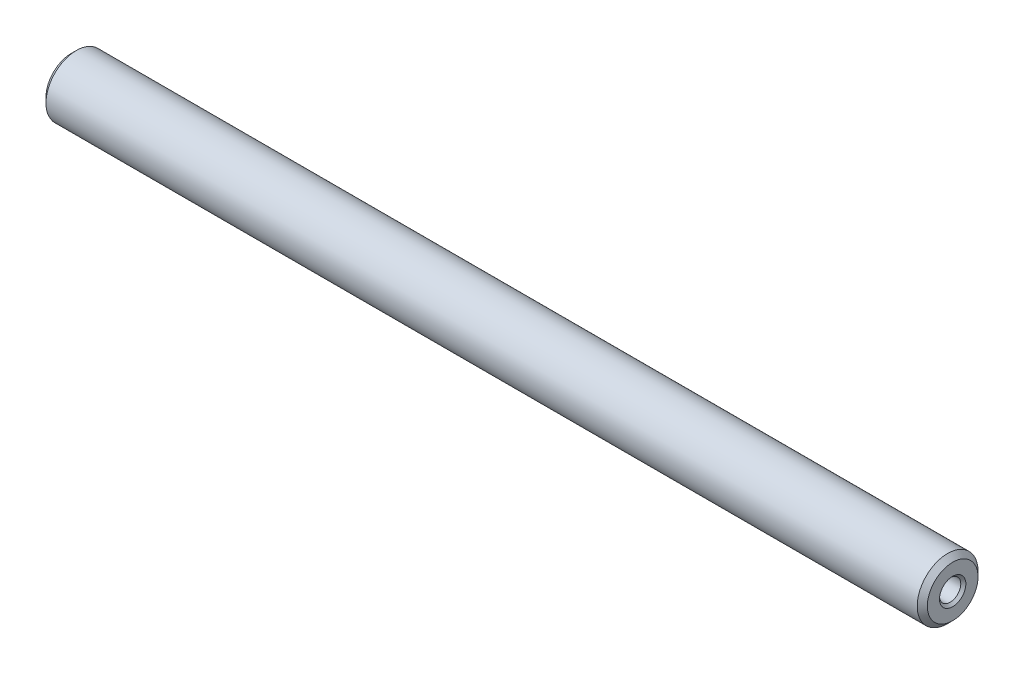
ISO-10303-21;
HEADER;
FILE_DESCRIPTION(('STEP AP214'),'2;1');
FILE_NAME('part.step','',(''),(''),'','','');
FILE_SCHEMA(('AUTOMOTIVE_DESIGN { 1 0 10303 214 1 1 1 1 }'));
ENDSEC;
DATA;
#1=APPLICATION_CONTEXT('core data for automotive mechanical design processes');
#2=APPLICATION_PROTOCOL_DEFINITION('international standard','automotive_design',2000,#1);
#3=PRODUCT_CONTEXT('',#1,'mechanical');
#4=PRODUCT('Part','Part','',(#3));
#5=PRODUCT_RELATED_PRODUCT_CATEGORY('part','',(#4));
#6=PRODUCT_DEFINITION_FORMATION('','',#4);
#7=PRODUCT_DEFINITION_CONTEXT('part definition',#1,'design');
#8=PRODUCT_DEFINITION('design','',#6,#7);
#9=PRODUCT_DEFINITION_SHAPE('','',#8);
#10=(LENGTH_UNIT() NAMED_UNIT(*) SI_UNIT(.MILLI.,.METRE.));
#11=(NAMED_UNIT(*) PLANE_ANGLE_UNIT() SI_UNIT($,.RADIAN.));
#12=(NAMED_UNIT(*) SI_UNIT($,.STERADIAN.) SOLID_ANGLE_UNIT());
#13=UNCERTAINTY_MEASURE_WITH_UNIT(LENGTH_MEASURE(1.E-05),#10,'distance_accuracy_value','');
#14=(GEOMETRIC_REPRESENTATION_CONTEXT(3) GLOBAL_UNCERTAINTY_ASSIGNED_CONTEXT((#13)) GLOBAL_UNIT_ASSIGNED_CONTEXT((#10,
#11,#12)) REPRESENTATION_CONTEXT('',''));
#15=CARTESIAN_POINT('',(0.,0.,0.));
#16=DIRECTION('',(0.,0.,1.));
#17=DIRECTION('',(1.,0.,0.));
#18=AXIS2_PLACEMENT_3D('',#15,#16,#17);
#19=CARTESIAN_POINT('',(174.,0.,0.));
#20=DIRECTION('',(-1.,0.,0.));
#21=DIRECTION('',(0.,0.,1.));
#22=AXIS2_PLACEMENT_3D('',#19,#20,#21);
#23=CYLINDRICAL_SURFACE('',#22,6.);
#24=CARTESIAN_POINT('',(173.,0.,0.));
#25=DIRECTION('',(1.,0.,0.));
#26=DIRECTION('',(0.,0.,-1.));
#27=AXIS2_PLACEMENT_3D('',#24,#25,#26);
#28=CIRCLE('',#27,6.);
#29=CARTESIAN_POINT('',(173.,0.,-6.));
#30=VERTEX_POINT('',#29);
#31=EDGE_CURVE('E72',#30,#30,#28,.F.);
#32=ORIENTED_EDGE('',*,*,#31,.T.);
#33=EDGE_LOOP('',(#32));
#34=FACE_BOUND('',#33,.T.);
#35=CARTESIAN_POINT('',(1.00000000000003,0.,0.));
#36=DIRECTION('',(1.,0.,0.));
#37=DIRECTION('',(0.,0.,-1.));
#38=AXIS2_PLACEMENT_3D('',#35,#36,#37);
#39=CIRCLE('',#38,6.);
#40=CARTESIAN_POINT('',(1.00000000000003,0.,-6.));
#41=VERTEX_POINT('',#40);
#42=EDGE_CURVE('E69',#41,#41,#39,.T.);
#43=ORIENTED_EDGE('',*,*,#42,.T.);
#44=EDGE_LOOP('',(#43));
#45=FACE_BOUND('',#44,.T.);
#46=ADVANCED_FACE('F37',(#34,#45),#23,.T.);
#47=CARTESIAN_POINT('',(174.,0.,0.));
#48=DIRECTION('',(1.,0.,0.));
#49=DIRECTION('',(0.,0.,-1.));
#50=AXIS2_PLACEMENT_3D('',#47,#48,#49);
#51=PLANE('',#50);
#52=CARTESIAN_POINT('',(174.,0.,0.));
#53=DIRECTION('',(1.,0.,0.));
#54=DIRECTION('',(0.,0.,-1.));
#55=AXIS2_PLACEMENT_3D('',#52,#53,#54);
#56=CIRCLE('',#55,2.59999999999995);
#57=CARTESIAN_POINT('',(174.,0.,-2.59999999999995));
#58=VERTEX_POINT('',#57);
#59=EDGE_CURVE('E81',#58,#58,#56,.F.);
#60=ORIENTED_EDGE('',*,*,#59,.T.);
#61=EDGE_LOOP('',(#60));
#62=FACE_BOUND('',#61,.T.);
#63=CARTESIAN_POINT('',(174.,0.,0.));
#64=DIRECTION('',(1.,0.,0.));
#65=DIRECTION('',(0.,0.,-1.));
#66=AXIS2_PLACEMENT_3D('',#63,#64,#65);
#67=CIRCLE('',#66,4.99999999999999);
#68=CARTESIAN_POINT('',(174.,0.,-4.99999999999999));
#69=VERTEX_POINT('',#68);
#70=EDGE_CURVE('E64',#69,#69,#67,.T.);
#71=ORIENTED_EDGE('',*,*,#70,.T.);
#72=EDGE_LOOP('',(#71));
#73=FACE_BOUND('',#72,.T.);
#74=ADVANCED_FACE('F95',(#62,#73),#51,.T.);
#75=CARTESIAN_POINT('',(0.,0.,0.));
#76=DIRECTION('',(1.,0.,0.));
#77=DIRECTION('',(0.,0.,-1.));
#78=AXIS2_PLACEMENT_3D('',#75,#76,#77);
#79=PLANE('',#78);
#80=CARTESIAN_POINT('',(0.,0.,0.));
#81=DIRECTION('',(1.,0.,0.));
#82=DIRECTION('',(0.,0.,-1.));
#83=AXIS2_PLACEMENT_3D('',#80,#81,#82);
#84=CIRCLE('',#83,2.60000000000002);
#85=CARTESIAN_POINT('',(0.,0.,-2.60000000000002));
#86=VERTEX_POINT('',#85);
#87=EDGE_CURVE('E11',#86,#86,#84,.T.);
#88=ORIENTED_EDGE('',*,*,#87,.T.);
#89=EDGE_LOOP('',(#88));
#90=FACE_BOUND('',#89,.T.);
#91=CARTESIAN_POINT('',(0.,0.,0.));
#92=DIRECTION('',(1.,0.,0.));
#93=DIRECTION('',(0.,0.,-1.));
#94=AXIS2_PLACEMENT_3D('',#91,#92,#93);
#95=CIRCLE('',#94,4.99999999999998);
#96=CARTESIAN_POINT('',(0.,0.,-4.99999999999998));
#97=VERTEX_POINT('',#96);
#98=EDGE_CURVE('E75',#97,#97,#95,.F.);
#99=ORIENTED_EDGE('',*,*,#98,.T.);
#100=EDGE_LOOP('',(#99));
#101=FACE_BOUND('',#100,.T.);
#102=ADVANCED_FACE('F101',(#90,#101),#79,.F.);
#103=CARTESIAN_POINT('',(174.,0.,0.));
#104=DIRECTION('',(-1.,0.,0.));
#105=DIRECTION('',(0.,0.,1.));
#106=AXIS2_PLACEMENT_3D('',#103,#104,#105);
#107=CONICAL_SURFACE('',#106,4.99999999999999,0.785398163397439);
#108=ORIENTED_EDGE('',*,*,#31,.F.);
#109=EDGE_LOOP('',(#108));
#110=FACE_BOUND('',#109,.T.);
#111=ORIENTED_EDGE('',*,*,#70,.F.);
#112=EDGE_LOOP('',(#111));
#113=FACE_BOUND('',#112,.T.);
#114=ADVANCED_FACE('F107',(#110,#113),#107,.T.);
#115=CARTESIAN_POINT('',(1.00000000000003,0.,0.));
#116=DIRECTION('',(1.,0.,0.));
#117=DIRECTION('',(0.,0.,-1.));
#118=AXIS2_PLACEMENT_3D('',#115,#116,#117);
#119=CONICAL_SURFACE('',#118,6.,0.785398163397446);
#120=ORIENTED_EDGE('',*,*,#98,.F.);
#121=EDGE_LOOP('',(#120));
#122=FACE_BOUND('',#121,.T.);
#123=ORIENTED_EDGE('',*,*,#42,.F.);
#124=EDGE_LOOP('',(#123));
#125=FACE_BOUND('',#124,.T.);
#126=ADVANCED_FACE('F110',(#122,#125),#119,.T.);
#127=CARTESIAN_POINT('',(160.,0.,0.));
#128=DIRECTION('',(1.,0.,0.));
#129=DIRECTION('',(0.,0.,-1.));
#130=AXIS2_PLACEMENT_3D('',#127,#128,#129);
#131=CONICAL_SURFACE('',#130,2.09999999999999,1.02974425867666);
#132=CARTESIAN_POINT('',(158.738192700042,0.,0.));
#133=VERTEX_POINT('',#132);
#134=VERTEX_LOOP('',#133);
#135=FACE_BOUND('',#134,.T.);
#136=CARTESIAN_POINT('',(160.,0.,0.));
#137=DIRECTION('',(1.,0.,0.));
#138=DIRECTION('',(0.,0.,-1.));
#139=AXIS2_PLACEMENT_3D('',#136,#137,#138);
#140=CIRCLE('',#139,2.09999999999999);
#141=CARTESIAN_POINT('',(160.,0.,-2.09999999999999));
#142=VERTEX_POINT('',#141);
#143=EDGE_CURVE('E61',#142,#142,#140,.T.);
#144=ORIENTED_EDGE('',*,*,#143,.T.);
#145=EDGE_LOOP('',(#144));
#146=FACE_BOUND('',#145,.T.);
#147=ADVANCED_FACE('F113',(#135,#146),#131,.F.);
#148=CARTESIAN_POINT('',(174.,0.,0.));
#149=DIRECTION('',(1.,0.,0.));
#150=DIRECTION('',(0.,0.,-1.));
#151=AXIS2_PLACEMENT_3D('',#148,#149,#150);
#152=CYLINDRICAL_SURFACE('',#151,2.09999999999999);
#153=CARTESIAN_POINT('',(173.5,0.,0.));
#154=DIRECTION('',(1.,0.,0.));
#155=DIRECTION('',(0.,0.,-1.));
#156=AXIS2_PLACEMENT_3D('',#153,#154,#155);
#157=CIRCLE('',#156,2.09999999999999);
#158=CARTESIAN_POINT('',(173.5,0.,-2.09999999999999));
#159=VERTEX_POINT('',#158);
#160=EDGE_CURVE('E78',#159,#159,#157,.T.);
#161=ORIENTED_EDGE('',*,*,#160,.T.);
#162=EDGE_LOOP('',(#161));
#163=FACE_BOUND('',#162,.T.);
#164=ORIENTED_EDGE('',*,*,#143,.F.);
#165=EDGE_LOOP('',(#164));
#166=FACE_BOUND('',#165,.T.);
#167=ADVANCED_FACE('F116',(#163,#166),#152,.F.);
#168=CARTESIAN_POINT('',(173.5,0.,0.));
#169=DIRECTION('',(1.,0.,0.));
#170=DIRECTION('',(0.,0.,-1.));
#171=AXIS2_PLACEMENT_3D('',#168,#169,#170);
#172=CONICAL_SURFACE('',#171,2.09999999999999,0.785398163397437);
#173=ORIENTED_EDGE('',*,*,#59,.F.);
#174=EDGE_LOOP('',(#173));
#175=FACE_BOUND('',#174,.T.);
#176=ORIENTED_EDGE('',*,*,#160,.F.);
#177=EDGE_LOOP('',(#176));
#178=FACE_BOUND('',#177,.T.);
#179=ADVANCED_FACE('F55',(#175,#178),#172,.F.);
#180=CARTESIAN_POINT('',(14.,0.,0.));
#181=DIRECTION('',(-1.,0.,0.));
#182=DIRECTION('',(0.,0.,1.));
#183=AXIS2_PLACEMENT_3D('',#180,#181,#182);
#184=CONICAL_SURFACE('',#183,2.09999999999999,1.02974425867665);
#185=CARTESIAN_POINT('',(15.2618072999579,0.,0.));
#186=VERTEX_POINT('',#185);
#187=VERTEX_LOOP('',#186);
#188=FACE_BOUND('',#187,.T.);
#189=CARTESIAN_POINT('',(14.,0.,0.));
#190=DIRECTION('',(-1.,0.,0.));
#191=DIRECTION('',(0.,0.,1.));
#192=AXIS2_PLACEMENT_3D('',#189,#190,#191);
#193=CIRCLE('',#192,2.09999999999999);
#194=CARTESIAN_POINT('',(14.,0.,2.09999999999999));
#195=VERTEX_POINT('',#194);
#196=EDGE_CURVE('E59',#195,#195,#193,.T.);
#197=ORIENTED_EDGE('',*,*,#196,.T.);
#198=EDGE_LOOP('',(#197));
#199=FACE_BOUND('',#198,.T.);
#200=ADVANCED_FACE('F51',(#188,#199),#184,.F.);
#201=CARTESIAN_POINT('',(0.,0.,0.));
#202=DIRECTION('',(-1.,0.,0.));
#203=DIRECTION('',(0.,0.,1.));
#204=AXIS2_PLACEMENT_3D('',#201,#202,#203);
#205=CYLINDRICAL_SURFACE('',#204,2.09999999999999);
#206=CARTESIAN_POINT('',(0.500000000000024,0.,0.));
#207=DIRECTION('',(1.,0.,0.));
#208=DIRECTION('',(0.,0.,-1.));
#209=AXIS2_PLACEMENT_3D('',#206,#207,#208);
#210=CIRCLE('',#209,2.09999999999999);
#211=CARTESIAN_POINT('',(0.500000000000024,0.,-2.09999999999999));
#212=VERTEX_POINT('',#211);
#213=EDGE_CURVE('E45',#212,#212,#210,.F.);
#214=ORIENTED_EDGE('',*,*,#213,.T.);
#215=EDGE_LOOP('',(#214));
#216=FACE_BOUND('',#215,.T.);
#217=ORIENTED_EDGE('',*,*,#196,.F.);
#218=EDGE_LOOP('',(#217));
#219=FACE_BOUND('',#218,.T.);
#220=ADVANCED_FACE('F54',(#216,#219),#205,.F.);
#221=CARTESIAN_POINT('',(0.500000000000024,0.,0.));
#222=DIRECTION('',(-1.,0.,0.));
#223=DIRECTION('',(0.,0.,1.));
#224=AXIS2_PLACEMENT_3D('',#221,#222,#223);
#225=CONICAL_SURFACE('',#224,2.09999999999999,0.785398163397455);
#226=ORIENTED_EDGE('',*,*,#87,.F.);
#227=EDGE_LOOP('',(#226));
#228=FACE_BOUND('',#227,.T.);
#229=ORIENTED_EDGE('',*,*,#213,.F.);
#230=EDGE_LOOP('',(#229));
#231=FACE_BOUND('',#230,.T.);
#232=ADVANCED_FACE('F39',(#228,#231),#225,.F.);
#233=CLOSED_SHELL('',(#46,#74,#102,#114,#126,#147,#167,#179,#200,#220,#232));
#234=MANIFOLD_SOLID_BREP('B2',#233);
#235=ADVANCED_BREP_SHAPE_REPRESENTATION('',(#18,#234),#14);
#236=SHAPE_DEFINITION_REPRESENTATION(#9,#235);
ENDSEC;
END-ISO-10303-21;
